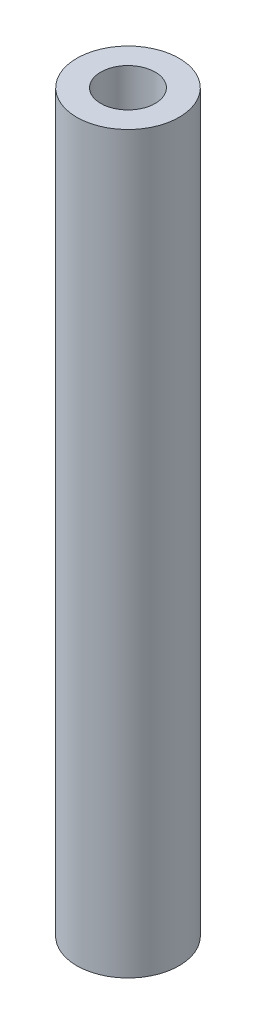
ISO-10303-21;
HEADER;
FILE_DESCRIPTION(('STEP AP214'),'2;1');
FILE_NAME('part.step','',(''),(''),'','','');
FILE_SCHEMA(('AUTOMOTIVE_DESIGN { 1 0 10303 214 1 1 1 1 }'));
ENDSEC;
DATA;
#1=APPLICATION_CONTEXT('core data for automotive mechanical design processes');
#2=APPLICATION_PROTOCOL_DEFINITION('international standard','automotive_design',2000,#1);
#3=PRODUCT_CONTEXT('',#1,'mechanical');
#4=PRODUCT('Part','Part','',(#3));
#5=PRODUCT_RELATED_PRODUCT_CATEGORY('part','',(#4));
#6=PRODUCT_DEFINITION_FORMATION('','',#4);
#7=PRODUCT_DEFINITION_CONTEXT('part definition',#1,'design');
#8=PRODUCT_DEFINITION('design','',#6,#7);
#9=PRODUCT_DEFINITION_SHAPE('','',#8);
#10=(LENGTH_UNIT() NAMED_UNIT(*) SI_UNIT(.MILLI.,.METRE.));
#11=(NAMED_UNIT(*) PLANE_ANGLE_UNIT() SI_UNIT($,.RADIAN.));
#12=(NAMED_UNIT(*) SI_UNIT($,.STERADIAN.) SOLID_ANGLE_UNIT());
#13=UNCERTAINTY_MEASURE_WITH_UNIT(LENGTH_MEASURE(1.E-05),#10,'distance_accuracy_value','');
#14=(GEOMETRIC_REPRESENTATION_CONTEXT(3) GLOBAL_UNCERTAINTY_ASSIGNED_CONTEXT((#13)) GLOBAL_UNIT_ASSIGNED_CONTEXT((#10,
#11,#12)) REPRESENTATION_CONTEXT('',''));
#15=CARTESIAN_POINT('',(0.,0.,0.));
#16=DIRECTION('',(0.,0.,1.));
#17=DIRECTION('',(1.,0.,0.));
#18=AXIS2_PLACEMENT_3D('',#15,#16,#17);
#19=CARTESIAN_POINT('',(0.,135.,0.));
#20=DIRECTION('',(0.,1.,0.));
#21=DIRECTION('',(0.,0.,1.));
#22=AXIS2_PLACEMENT_3D('',#19,#20,#21);
#23=PLANE('',#22);
#24=CARTESIAN_POINT('',(0.,135.,0.));
#25=DIRECTION('',(0.,1.,0.));
#26=DIRECTION('',(0.,0.,1.));
#27=AXIS2_PLACEMENT_3D('',#24,#25,#26);
#28=CIRCLE('',#27,9.398);
#29=CARTESIAN_POINT('',(0.,135.,9.398));
#30=VERTEX_POINT('',#29);
#31=EDGE_CURVE('E10',#30,#30,#28,.T.);
#32=ORIENTED_EDGE('',*,*,#31,.T.);
#33=EDGE_LOOP('',(#32));
#34=FACE_BOUND('',#33,.T.);
#35=CARTESIAN_POINT('',(0.,135.,0.));
#36=DIRECTION('',(0.,1.,0.));
#37=DIRECTION('',(0.,0.,1.));
#38=AXIS2_PLACEMENT_3D('',#35,#36,#37);
#39=CIRCLE('',#38,5.);
#40=CARTESIAN_POINT('',(0.,135.,5.));
#41=VERTEX_POINT('',#40);
#42=EDGE_CURVE('E50',#41,#41,#39,.T.);
#43=ORIENTED_EDGE('',*,*,#42,.F.);
#44=EDGE_LOOP('',(#43));
#45=FACE_BOUND('',#44,.T.);
#46=ADVANCED_FACE('F39',(#34,#45),#23,.T.);
#47=CARTESIAN_POINT('',(0.,0.,0.));
#48=DIRECTION('',(0.,1.,0.));
#49=DIRECTION('',(0.,0.,1.));
#50=AXIS2_PLACEMENT_3D('',#47,#48,#49);
#51=PLANE('',#50);
#52=CARTESIAN_POINT('',(0.,0.,0.));
#53=DIRECTION('',(0.,1.,0.));
#54=DIRECTION('',(0.,0.,1.));
#55=AXIS2_PLACEMENT_3D('',#52,#53,#54);
#56=CIRCLE('',#55,9.398);
#57=CARTESIAN_POINT('',(0.,0.,9.398));
#58=VERTEX_POINT('',#57);
#59=EDGE_CURVE('E43',#58,#58,#56,.T.);
#60=ORIENTED_EDGE('',*,*,#59,.F.);
#61=EDGE_LOOP('',(#60));
#62=FACE_BOUND('',#61,.T.);
#63=CARTESIAN_POINT('',(0.,0.,0.));
#64=DIRECTION('',(0.,1.,0.));
#65=DIRECTION('',(0.,0.,1.));
#66=AXIS2_PLACEMENT_3D('',#63,#64,#65);
#67=CIRCLE('',#66,5.);
#68=CARTESIAN_POINT('',(0.,0.,5.));
#69=VERTEX_POINT('',#68);
#70=EDGE_CURVE('E52',#69,#69,#67,.T.);
#71=ORIENTED_EDGE('',*,*,#70,.T.);
#72=EDGE_LOOP('',(#71));
#73=FACE_BOUND('',#72,.T.);
#74=ADVANCED_FACE('F62',(#62,#73),#51,.F.);
#75=CARTESIAN_POINT('',(0.,135.,0.));
#76=DIRECTION('',(0.,-1.,0.));
#77=DIRECTION('',(0.,0.,-1.));
#78=AXIS2_PLACEMENT_3D('',#75,#76,#77);
#79=CYLINDRICAL_SURFACE('',#78,9.398);
#80=ORIENTED_EDGE('',*,*,#31,.F.);
#81=EDGE_LOOP('',(#80));
#82=FACE_BOUND('',#81,.T.);
#83=ORIENTED_EDGE('',*,*,#59,.T.);
#84=EDGE_LOOP('',(#83));
#85=FACE_BOUND('',#84,.T.);
#86=ADVANCED_FACE('F41',(#82,#85),#79,.T.);
#87=CARTESIAN_POINT('',(0.,135.,0.));
#88=DIRECTION('',(0.,-1.,0.));
#89=DIRECTION('',(0.,0.,-1.));
#90=AXIS2_PLACEMENT_3D('',#87,#88,#89);
#91=CYLINDRICAL_SURFACE('',#90,5.);
#92=ORIENTED_EDGE('',*,*,#42,.T.);
#93=EDGE_LOOP('',(#92));
#94=FACE_BOUND('',#93,.T.);
#95=ORIENTED_EDGE('',*,*,#70,.F.);
#96=EDGE_LOOP('',(#95));
#97=FACE_BOUND('',#96,.T.);
#98=ADVANCED_FACE('F58',(#94,#97),#91,.F.);
#99=CLOSED_SHELL('',(#46,#74,#86,#98));
#100=MANIFOLD_SOLID_BREP('B2',#99);
#101=ADVANCED_BREP_SHAPE_REPRESENTATION('',(#18,#100),#14);
#102=SHAPE_DEFINITION_REPRESENTATION(#9,#101);
ENDSEC;
END-ISO-10303-21;
